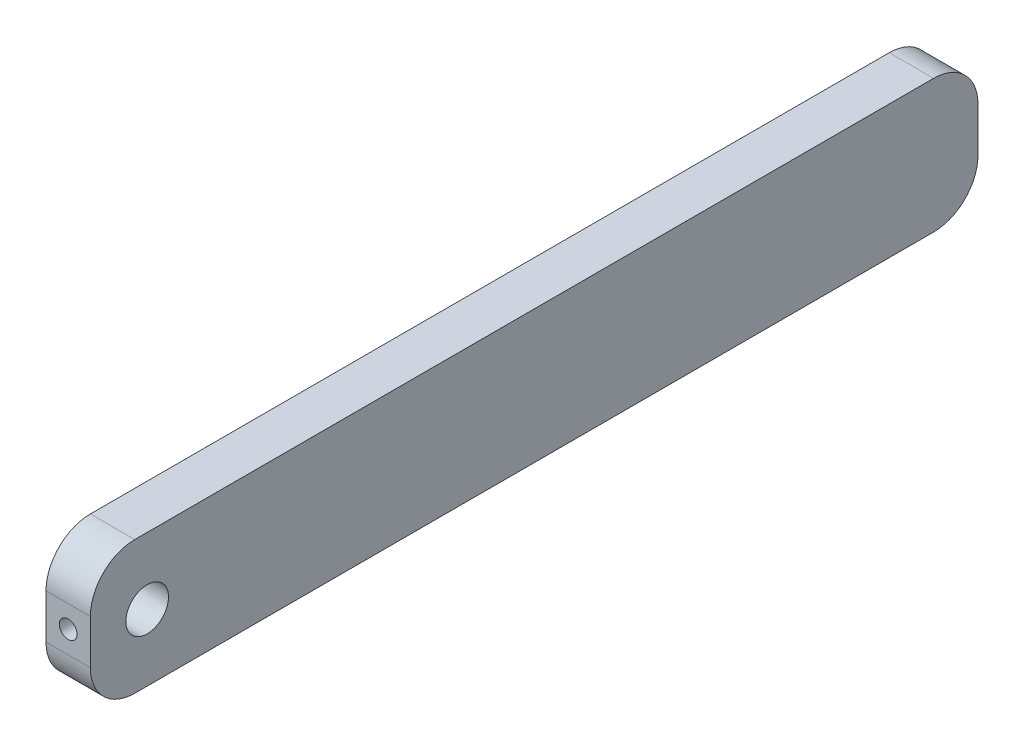
ISO-10303-21;
HEADER;
FILE_DESCRIPTION(('STEP AP214'),'2;1');
FILE_NAME('part.step','',(''),(''),'','','');
FILE_SCHEMA(('AUTOMOTIVE_DESIGN { 1 0 10303 214 1 1 1 1 }'));
ENDSEC;
DATA;
#1=APPLICATION_CONTEXT('core data for automotive mechanical design processes');
#2=APPLICATION_PROTOCOL_DEFINITION('international standard','automotive_design',2000,#1);
#3=PRODUCT_CONTEXT('',#1,'mechanical');
#4=PRODUCT('Part','Part','',(#3));
#5=PRODUCT_RELATED_PRODUCT_CATEGORY('part','',(#4));
#6=PRODUCT_DEFINITION_FORMATION('','',#4);
#7=PRODUCT_DEFINITION_CONTEXT('part definition',#1,'design');
#8=PRODUCT_DEFINITION('design','',#6,#7);
#9=PRODUCT_DEFINITION_SHAPE('','',#8);
#10=(LENGTH_UNIT() NAMED_UNIT(*) SI_UNIT(.MILLI.,.METRE.));
#11=(NAMED_UNIT(*) PLANE_ANGLE_UNIT() SI_UNIT($,.RADIAN.));
#12=(NAMED_UNIT(*) SI_UNIT($,.STERADIAN.) SOLID_ANGLE_UNIT());
#13=UNCERTAINTY_MEASURE_WITH_UNIT(LENGTH_MEASURE(1.E-05),#10,'distance_accuracy_value','');
#14=(GEOMETRIC_REPRESENTATION_CONTEXT(3) GLOBAL_UNCERTAINTY_ASSIGNED_CONTEXT((#13)) GLOBAL_UNIT_ASSIGNED_CONTEXT((#10,
#11,#12)) REPRESENTATION_CONTEXT('',''));
#15=CARTESIAN_POINT('',(0.,0.,0.));
#16=DIRECTION('',(0.,0.,1.));
#17=DIRECTION('',(1.,0.,0.));
#18=AXIS2_PLACEMENT_3D('',#15,#16,#17);
#19=CARTESIAN_POINT('',(5.,0.,0.));
#20=DIRECTION('',(0.,0.,-1.));
#21=DIRECTION('',(-1.,0.,0.));
#22=AXIS2_PLACEMENT_3D('',#19,#20,#21);
#23=PLANE('',#22);
#24=CARTESIAN_POINT('',(2.5,7.5,0.));
#25=DIRECTION('',(0.,0.,1.));
#26=DIRECTION('',(1.,0.,0.));
#27=AXIS2_PLACEMENT_3D('',#24,#25,#26);
#28=CIRCLE('',#27,1.);
#29=CARTESIAN_POINT('',(3.5,7.5,0.));
#30=VERTEX_POINT('',#29);
#31=EDGE_CURVE('E186',#30,#30,#28,.T.);
#32=ORIENTED_EDGE('',*,*,#31,.F.);
#33=EDGE_LOOP('',(#32));
#34=FACE_BOUND('',#33,.T.);
#35=DIRECTION('',(0.,-1.,0.));
#36=VECTOR('',#35,1.);
#37=CARTESIAN_POINT('',(0.,0.,0.));
#38=LINE('',#37,#36);
#39=CARTESIAN_POINT('',(0.,10.,0.));
#40=VERTEX_POINT('',#39);
#41=CARTESIAN_POINT('',(0.,5.,0.));
#42=VERTEX_POINT('',#41);
#43=EDGE_CURVE('E139',#40,#42,#38,.T.);
#44=ORIENTED_EDGE('',*,*,#43,.T.);
#45=DIRECTION('',(-1.,0.,0.));
#46=VECTOR('',#45,1.);
#47=CARTESIAN_POINT('',(5.,5.,0.));
#48=LINE('',#47,#46);
#49=CARTESIAN_POINT('',(5.,5.,0.));
#50=VERTEX_POINT('',#49);
#51=EDGE_CURVE('E11',#42,#50,#48,.F.);
#52=ORIENTED_EDGE('',*,*,#51,.T.);
#53=DIRECTION('',(0.,-1.,0.));
#54=VECTOR('',#53,1.);
#55=CARTESIAN_POINT('',(5.,0.,0.));
#56=LINE('',#55,#54);
#57=CARTESIAN_POINT('',(5.,10.,0.));
#58=VERTEX_POINT('',#57);
#59=EDGE_CURVE('E137',#58,#50,#56,.T.);
#60=ORIENTED_EDGE('',*,*,#59,.F.);
#61=DIRECTION('',(-1.,0.,0.));
#62=VECTOR('',#61,1.);
#63=CARTESIAN_POINT('',(5.,10.,0.));
#64=LINE('',#63,#62);
#65=EDGE_CURVE('E51',#58,#40,#64,.T.);
#66=ORIENTED_EDGE('',*,*,#65,.T.);
#67=EDGE_LOOP('',(#44,#52,#60,#66));
#68=FACE_BOUND('',#67,.T.);
#69=ADVANCED_FACE('F37',(#34,#68),#23,.F.);
#70=CARTESIAN_POINT('',(5.,0.,0.));
#71=DIRECTION('',(0.,1.,0.));
#72=DIRECTION('',(0.,0.,1.));
#73=AXIS2_PLACEMENT_3D('',#70,#71,#72);
#74=PLANE('',#73);
#75=DIRECTION('',(0.,0.,-1.));
#76=VECTOR('',#75,1.);
#77=CARTESIAN_POINT('',(0.,0.,0.));
#78=LINE('',#77,#76);
#79=CARTESIAN_POINT('',(0.,0.,-5.));
#80=VERTEX_POINT('',#79);
#81=CARTESIAN_POINT('',(0.,0.,-95.));
#82=VERTEX_POINT('',#81);
#83=EDGE_CURVE('E135',#80,#82,#78,.T.);
#84=ORIENTED_EDGE('',*,*,#83,.T.);
#85=DIRECTION('',(-1.,0.,0.));
#86=VECTOR('',#85,1.);
#87=CARTESIAN_POINT('',(5.,0.,-95.));
#88=LINE('',#87,#86);
#89=CARTESIAN_POINT('',(5.,0.,-95.));
#90=VERTEX_POINT('',#89);
#91=EDGE_CURVE('E114',#82,#90,#88,.F.);
#92=ORIENTED_EDGE('',*,*,#91,.T.);
#93=DIRECTION('',(0.,0.,-1.));
#94=VECTOR('',#93,1.);
#95=CARTESIAN_POINT('',(5.,0.,0.));
#96=LINE('',#95,#94);
#97=CARTESIAN_POINT('',(5.,0.,-5.));
#98=VERTEX_POINT('',#97);
#99=EDGE_CURVE('E180',#98,#90,#96,.T.);
#100=ORIENTED_EDGE('',*,*,#99,.F.);
#101=DIRECTION('',(-1.,0.,0.));
#102=VECTOR('',#101,1.);
#103=CARTESIAN_POINT('',(5.,0.,-5.));
#104=LINE('',#103,#102);
#105=EDGE_CURVE('E119',#98,#80,#104,.T.);
#106=ORIENTED_EDGE('',*,*,#105,.T.);
#107=EDGE_LOOP('',(#84,#92,#100,#106));
#108=FACE_BOUND('',#107,.T.);
#109=ADVANCED_FACE('F204',(#108),#74,.F.);
#110=CARTESIAN_POINT('',(5.,0.,-100.));
#111=DIRECTION('',(0.,0.,1.));
#112=DIRECTION('',(1.,0.,0.));
#113=AXIS2_PLACEMENT_3D('',#110,#111,#112);
#114=PLANE('',#113);
#115=DIRECTION('',(0.,1.,0.));
#116=VECTOR('',#115,1.);
#117=CARTESIAN_POINT('',(5.,0.,-100.));
#118=LINE('',#117,#116);
#119=CARTESIAN_POINT('',(5.,5.,-100.));
#120=VERTEX_POINT('',#119);
#121=CARTESIAN_POINT('',(5.,10.,-100.));
#122=VERTEX_POINT('',#121);
#123=EDGE_CURVE('E128',#120,#122,#118,.T.);
#124=ORIENTED_EDGE('',*,*,#123,.F.);
#125=DIRECTION('',(-1.,0.,0.));
#126=VECTOR('',#125,1.);
#127=CARTESIAN_POINT('',(5.,5.,-100.));
#128=LINE('',#127,#126);
#129=CARTESIAN_POINT('',(0.,5.,-100.));
#130=VERTEX_POINT('',#129);
#131=EDGE_CURVE('E113',#120,#130,#128,.T.);
#132=ORIENTED_EDGE('',*,*,#131,.T.);
#133=DIRECTION('',(0.,1.,0.));
#134=VECTOR('',#133,1.);
#135=CARTESIAN_POINT('',(0.,0.,-100.));
#136=LINE('',#135,#134);
#137=CARTESIAN_POINT('',(0.,10.,-100.));
#138=VERTEX_POINT('',#137);
#139=EDGE_CURVE('E126',#130,#138,#136,.T.);
#140=ORIENTED_EDGE('',*,*,#139,.T.);
#141=DIRECTION('',(-1.,0.,0.));
#142=VECTOR('',#141,1.);
#143=CARTESIAN_POINT('',(5.,10.,-100.));
#144=LINE('',#143,#142);
#145=EDGE_CURVE('E130',#138,#122,#144,.F.);
#146=ORIENTED_EDGE('',*,*,#145,.T.);
#147=EDGE_LOOP('',(#124,#132,#140,#146));
#148=FACE_BOUND('',#147,.T.);
#149=ADVANCED_FACE('F125',(#148),#114,.F.);
#150=CARTESIAN_POINT('',(5.,15.,0.));
#151=DIRECTION('',(0.,-1.,0.));
#152=DIRECTION('',(0.,0.,-1.));
#153=AXIS2_PLACEMENT_3D('',#150,#151,#152);
#154=PLANE('',#153);
#155=DIRECTION('',(0.,0.,1.));
#156=VECTOR('',#155,1.);
#157=CARTESIAN_POINT('',(5.,15.,0.));
#158=LINE('',#157,#156);
#159=CARTESIAN_POINT('',(5.,15.,-95.));
#160=VERTEX_POINT('',#159);
#161=CARTESIAN_POINT('',(5.,15.,-5.));
#162=VERTEX_POINT('',#161);
#163=EDGE_CURVE('E143',#160,#162,#158,.T.);
#164=ORIENTED_EDGE('',*,*,#163,.F.);
#165=DIRECTION('',(-1.,0.,0.));
#166=VECTOR('',#165,1.);
#167=CARTESIAN_POINT('',(5.,15.,-95.));
#168=LINE('',#167,#166);
#169=CARTESIAN_POINT('',(0.,15.,-95.));
#170=VERTEX_POINT('',#169);
#171=EDGE_CURVE('E160',#160,#170,#168,.T.);
#172=ORIENTED_EDGE('',*,*,#171,.T.);
#173=DIRECTION('',(0.,0.,1.));
#174=VECTOR('',#173,1.);
#175=CARTESIAN_POINT('',(0.,15.,0.));
#176=LINE('',#175,#174);
#177=CARTESIAN_POINT('',(0.,15.,-5.));
#178=VERTEX_POINT('',#177);
#179=EDGE_CURVE('E134',#170,#178,#176,.T.);
#180=ORIENTED_EDGE('',*,*,#179,.T.);
#181=DIRECTION('',(-1.,0.,0.));
#182=VECTOR('',#181,1.);
#183=CARTESIAN_POINT('',(5.,15.,-5.));
#184=LINE('',#183,#182);
#185=EDGE_CURVE('E58',#178,#162,#184,.F.);
#186=ORIENTED_EDGE('',*,*,#185,.T.);
#187=EDGE_LOOP('',(#164,#172,#180,#186));
#188=FACE_BOUND('',#187,.T.);
#189=ADVANCED_FACE('F228',(#188),#154,.F.);
#190=CARTESIAN_POINT('',(5.,0.,0.));
#191=DIRECTION('',(-1.,0.,0.));
#192=DIRECTION('',(0.,0.,1.));
#193=AXIS2_PLACEMENT_3D('',#190,#191,#192);
#194=PLANE('',#193);
#195=CARTESIAN_POINT('',(5.,7.5,-6.4));
#196=DIRECTION('',(1.,0.,0.));
#197=DIRECTION('',(0.,0.,-1.));
#198=AXIS2_PLACEMENT_3D('',#195,#196,#197);
#199=CIRCLE('',#198,2.4);
#200=CARTESIAN_POINT('',(5.,7.5,-8.8));
#201=VERTEX_POINT('',#200);
#202=EDGE_CURVE('E175',#201,#201,#199,.T.);
#203=ORIENTED_EDGE('',*,*,#202,.F.);
#204=EDGE_LOOP('',(#203));
#205=FACE_BOUND('',#204,.T.);
#206=ORIENTED_EDGE('',*,*,#99,.T.);
#207=CARTESIAN_POINT('',(5.,5.,-95.));
#208=DIRECTION('',(-1.,0.,0.));
#209=DIRECTION('',(0.,0.,1.));
#210=AXIS2_PLACEMENT_3D('',#207,#208,#209);
#211=CIRCLE('',#210,5.);
#212=EDGE_CURVE('E157',#90,#120,#211,.F.);
#213=ORIENTED_EDGE('',*,*,#212,.T.);
#214=ORIENTED_EDGE('',*,*,#123,.T.);
#215=CARTESIAN_POINT('',(5.,10.,-95.));
#216=DIRECTION('',(-1.,0.,0.));
#217=DIRECTION('',(0.,0.,1.));
#218=AXIS2_PLACEMENT_3D('',#215,#216,#217);
#219=CIRCLE('',#218,5.);
#220=EDGE_CURVE('E65',#122,#160,#219,.F.);
#221=ORIENTED_EDGE('',*,*,#220,.T.);
#222=ORIENTED_EDGE('',*,*,#163,.T.);
#223=CARTESIAN_POINT('',(5.,10.,-5.));
#224=DIRECTION('',(-1.,0.,0.));
#225=DIRECTION('',(0.,0.,1.));
#226=AXIS2_PLACEMENT_3D('',#223,#224,#225);
#227=CIRCLE('',#226,5.);
#228=EDGE_CURVE('E152',#162,#58,#227,.F.);
#229=ORIENTED_EDGE('',*,*,#228,.T.);
#230=ORIENTED_EDGE('',*,*,#59,.T.);
#231=CARTESIAN_POINT('',(5.,5.,-5.));
#232=DIRECTION('',(-1.,0.,0.));
#233=DIRECTION('',(0.,0.,1.));
#234=AXIS2_PLACEMENT_3D('',#231,#232,#233);
#235=CIRCLE('',#234,5.);
#236=EDGE_CURVE('E154',#50,#98,#235,.F.);
#237=ORIENTED_EDGE('',*,*,#236,.T.);
#238=EDGE_LOOP('',(#206,#213,#214,#221,#222,#229,#230,#237));
#239=FACE_BOUND('',#238,.T.);
#240=ADVANCED_FACE('F226',(#205,#239),#194,.F.);
#241=CARTESIAN_POINT('',(0.,0.,0.));
#242=DIRECTION('',(-1.,0.,0.));
#243=DIRECTION('',(0.,0.,1.));
#244=AXIS2_PLACEMENT_3D('',#241,#242,#243);
#245=PLANE('',#244);
#246=CARTESIAN_POINT('',(0.,7.5,-6.4));
#247=DIRECTION('',(1.,0.,0.));
#248=DIRECTION('',(0.,0.,-1.));
#249=AXIS2_PLACEMENT_3D('',#246,#247,#248);
#250=CIRCLE('',#249,2.4);
#251=CARTESIAN_POINT('',(0.,7.5,-8.8));
#252=VERTEX_POINT('',#251);
#253=EDGE_CURVE('E173',#252,#252,#250,.T.);
#254=ORIENTED_EDGE('',*,*,#253,.T.);
#255=EDGE_LOOP('',(#254));
#256=FACE_BOUND('',#255,.T.);
#257=ORIENTED_EDGE('',*,*,#139,.F.);
#258=CARTESIAN_POINT('',(0.,5.,-95.));
#259=DIRECTION('',(-1.,0.,0.));
#260=DIRECTION('',(0.,0.,1.));
#261=AXIS2_PLACEMENT_3D('',#258,#259,#260);
#262=CIRCLE('',#261,5.);
#263=EDGE_CURVE('E109',#130,#82,#262,.T.);
#264=ORIENTED_EDGE('',*,*,#263,.T.);
#265=ORIENTED_EDGE('',*,*,#83,.F.);
#266=CARTESIAN_POINT('',(0.,5.,-5.));
#267=DIRECTION('',(-1.,0.,0.));
#268=DIRECTION('',(0.,0.,1.));
#269=AXIS2_PLACEMENT_3D('',#266,#267,#268);
#270=CIRCLE('',#269,5.);
#271=EDGE_CURVE('E146',#80,#42,#270,.T.);
#272=ORIENTED_EDGE('',*,*,#271,.T.);
#273=ORIENTED_EDGE('',*,*,#43,.F.);
#274=CARTESIAN_POINT('',(0.,10.,-5.));
#275=DIRECTION('',(-1.,0.,0.));
#276=DIRECTION('',(0.,0.,1.));
#277=AXIS2_PLACEMENT_3D('',#274,#275,#276);
#278=CIRCLE('',#277,5.);
#279=EDGE_CURVE('E129',#40,#178,#278,.T.);
#280=ORIENTED_EDGE('',*,*,#279,.T.);
#281=ORIENTED_EDGE('',*,*,#179,.F.);
#282=CARTESIAN_POINT('',(0.,10.,-95.));
#283=DIRECTION('',(-1.,0.,0.));
#284=DIRECTION('',(0.,0.,1.));
#285=AXIS2_PLACEMENT_3D('',#282,#283,#284);
#286=CIRCLE('',#285,5.);
#287=EDGE_CURVE('E120',#170,#138,#286,.T.);
#288=ORIENTED_EDGE('',*,*,#287,.T.);
#289=EDGE_LOOP('',(#257,#264,#265,#272,#273,#280,#281,#288));
#290=FACE_BOUND('',#289,.T.);
#291=ADVANCED_FACE('F132',(#256,#290),#245,.T.);
#292=CARTESIAN_POINT('',(0.,7.5,-6.4));
#293=DIRECTION('',(1.,0.,0.));
#294=DIRECTION('',(0.,0.,-1.));
#295=AXIS2_PLACEMENT_3D('',#292,#293,#294);
#296=CYLINDRICAL_SURFACE('',#295,2.4);
#297=CARTESIAN_POINT('',(3.5,7.5,-4.));
#298=CARTESIAN_POINT('',(3.49999423592696,7.55356644210901,-4.00000433306182));
#299=CARTESIAN_POINT('',(3.49567043317749,7.60721711765107,-4.00181413620232));
#300=CARTESIAN_POINT('',(3.47852874806386,7.71299789692508,-4.00887877136359));
#301=CARTESIAN_POINT('',(3.4656887004286,7.76512366113885,-4.01414259279178));
#302=CARTESIAN_POINT('',(3.43207112657553,7.86615098692247,-4.02754968769499));
#303=CARTESIAN_POINT('',(3.41132048842548,7.91506281954101,-4.03568320019997));
#304=CARTESIAN_POINT('',(3.36258174141395,8.00866380534384,-4.05403770823469));
#305=CARTESIAN_POINT('',(3.33459582482331,8.05335423201275,-4.06425807125721));
#306=CARTESIAN_POINT('',(3.2706968139273,8.13955872284761,-4.08633737318505));
#307=CARTESIAN_POINT('',(3.2344789529682,8.18083301401422,-4.09824997339126));
#308=CARTESIAN_POINT('',(3.15578853217395,8.25692785687301,-4.12213828745189));
#309=CARTESIAN_POINT('',(3.1133127000844,8.29174501052247,-4.13411403114553));
#310=CARTESIAN_POINT('',(3.02077857794808,8.35562990157653,-4.15743182549604));
#311=CARTESIAN_POINT('',(2.97045004125876,8.3843304652314,-4.16871370501293));
#312=CARTESIAN_POINT('',(2.86514139366326,8.43275152471093,-4.18851542114396));
#313=CARTESIAN_POINT('',(2.81016369641244,8.45247664669033,-4.19703667999342));
#314=CARTESIAN_POINT('',(2.69987704658566,8.48139678649727,-4.20977155689837));
#315=CARTESIAN_POINT('',(2.64471161328628,8.49105326302085,-4.21417289878571));
#316=CARTESIAN_POINT('',(2.53338136585074,8.50100167974237,-4.21870939024397));
#317=CARTESIAN_POINT('',(2.47721711997941,8.50129878443518,-4.21884689259793));
#318=CARTESIAN_POINT('',(2.37007995165205,8.49286760290939,-4.21499904351318));
#319=CARTESIAN_POINT('',(2.31903912274843,8.48482944889841,-4.21132893821102));
#320=CARTESIAN_POINT('',(2.21911032719969,8.46111352812621,-4.20081213780963));
#321=CARTESIAN_POINT('',(2.17022277480658,8.44543429829742,-4.19396483437149));
#322=CARTESIAN_POINT('',(2.07475383760685,8.40657566982057,-4.17771052181795));
#323=CARTESIAN_POINT('',(2.0282436632693,8.38324377231389,-4.16825214440691));
#324=CARTESIAN_POINT('',(1.93961781289588,8.3298499406445,-4.14785335087132));
#325=CARTESIAN_POINT('',(1.89750387950919,8.29978535241564,-4.13691235096177));
#326=CARTESIAN_POINT('',(1.81512003301373,8.23079677243507,-4.11365618497617));
#327=CARTESIAN_POINT('',(1.77530674609165,8.19133878656602,-4.10130302876422));
#328=CARTESIAN_POINT('',(1.70270919763265,8.10618367284121,-4.07739461509977));
#329=CARTESIAN_POINT('',(1.66992658264626,8.06048508755877,-4.06583954498392));
#330=CARTESIAN_POINT('',(1.61165134110699,7.9627583589547,-4.04449373154822));
#331=CARTESIAN_POINT('',(1.58634444387945,7.91060846595814,-4.03474986765333));
#332=CARTESIAN_POINT('',(1.54502308831739,7.80228192202147,-4.01848414868158));
#333=CARTESIAN_POINT('',(1.52900349444495,7.74610751583603,-4.0119605132336));
#334=CARTESIAN_POINT('',(1.50766720629869,7.63514249067698,-4.00320287050892));
#335=CARTESIAN_POINT('',(1.501737714045,7.58048902822291,-4.000723671623));
#336=CARTESIAN_POINT('',(1.49892302110872,7.47091627560313,-3.99955159705004));
#337=CARTESIAN_POINT('',(1.5020352237984,7.41599706627789,-4.00085763430449));
#338=CARTESIAN_POINT('',(1.51677686784485,7.31032140612685,-4.00695025874448));
#339=CARTESIAN_POINT('',(1.52797596327776,7.25949362668849,-4.01156090172809));
#340=CARTESIAN_POINT('',(1.55797455563263,7.16049380082313,-4.02361114582069));
#341=CARTESIAN_POINT('',(1.57677501276024,7.11232209078531,-4.03105110432237));
#342=CARTESIAN_POINT('',(1.62205678056969,7.01831280010469,-4.04833383483868));
#343=CARTESIAN_POINT('',(1.64875854651683,6.97259421051574,-4.05824406824575));
#344=CARTESIAN_POINT('',(1.70884270223335,6.88612302701486,-4.07940956336728));
#345=CARTESIAN_POINT('',(1.74222788122342,6.84537251791845,-4.09066538585014));
#346=CARTESIAN_POINT('',(1.81752258661792,6.76693325578059,-4.1143032968365));
#347=CARTESIAN_POINT('',(1.85987080238901,6.72967144161613,-4.12670838727177));
#348=CARTESIAN_POINT('',(1.95041702074831,6.66266412311559,-4.15052530585596));
#349=CARTESIAN_POINT('',(1.99861634813739,6.63292032571506,-4.1619369080525));
#350=CARTESIAN_POINT('',(2.10049134024206,6.58147231833041,-4.1825489100481));
#351=CARTESIAN_POINT('',(2.15423522841186,6.55988865410137,-4.19171549955911));
#352=CARTESIAN_POINT('',(2.26509647504808,6.52626068838742,-4.20633315472835));
#353=CARTESIAN_POINT('',(2.32221100998668,6.5142085210905,-4.21178728355399));
#354=CARTESIAN_POINT('',(2.43345495935937,6.50076735720879,-4.21789468370189));
#355=CARTESIAN_POINT('',(2.48747572983409,6.49862895669497,-4.2188851922627));
#356=CARTESIAN_POINT('',(2.59507428891288,6.5030753958087,-4.21684917591181));
#357=CARTESIAN_POINT('',(2.64865214425095,6.50965889628223,-4.21382326767755));
#358=CARTESIAN_POINT('',(2.75127419797511,6.53073276175607,-4.20440358958186));
#359=CARTESIAN_POINT('',(2.80041333877071,6.54484077142827,-4.19817316122816));
#360=CARTESIAN_POINT('',(2.89563841708578,6.58018937438292,-4.18317455040649));
#361=CARTESIAN_POINT('',(2.94172349231903,6.60143197186198,-4.17440565494646));
#362=CARTESIAN_POINT('',(3.0325567167593,6.65191771251608,-4.1546643635199));
#363=CARTESIAN_POINT('',(3.07705786413463,6.68156511271613,-4.14359117829057));
#364=CARTESIAN_POINT('',(3.16068811148854,6.74745274189569,-4.12077048756929));
#365=CARTESIAN_POINT('',(3.19981534048046,6.7836952568755,-4.109022749233));
#366=CARTESIAN_POINT('',(3.27451894534779,6.86487836337694,-4.08514885719915));
#367=CARTESIAN_POINT('',(3.30962914627252,6.91026020804078,-4.07305745990567));
#368=CARTESIAN_POINT('',(3.3717595628349,7.00671993659744,-4.05071885102384));
#369=CARTESIAN_POINT('',(3.39877609191164,7.0578004016434,-4.04047248066608));
#370=CARTESIAN_POINT('',(3.44336787635191,7.16341435462564,-4.02312653310032));
#371=CARTESIAN_POINT('',(3.46109181329384,7.21787680721549,-4.01597773934429));
#372=CARTESIAN_POINT('',(3.48696506326227,7.32927166252275,-4.00543192185101));
#373=CARTESIAN_POINT('',(3.49514435402391,7.38619574641523,-4.00202315350427));
#374=CARTESIAN_POINT('',(3.49946652886916,7.46221113446465,-4.00022169944853));
#375=CARTESIAN_POINT('',(3.50000203371938,7.48110032425947,-3.99999847117972));
#376=CARTESIAN_POINT('',(3.5,7.5,-4.));
#377=B_SPLINE_CURVE_WITH_KNOTS('',3,(#297,#298,#299,#300,#301,#302,#303,#304,#305,#306,#307,
#308,#309,#310,#311,#312,#313,#314,#315,#316,#317,#318,#319,#320,#321,#322,#323,#324,#325,#326,
#327,#328,#329,#330,#331,#332,#333,#334,#335,#336,#337,#338,#339,#340,#341,#342,#343,#344,#345,
#346,#347,#348,#349,#350,#351,#352,#353,#354,#355,#356,#357,#358,#359,#360,#361,#362,#363,#364,
#365,#366,#367,#368,#369,#370,#371,#372,#373,#374,#375,#376),.UNSPECIFIED.,.T.,.F.,(4,2,2,2,2,2,
2,2,2,2,2,2,2,2,2,2,2,2,2,2,2,2,2,2,2,2,2,2,2,2,2,2,2,2,2,2,2,2,2,4),(0.,0.16064553510715,
0.321710832502957,0.482233481525039,0.642707549482379,0.810543490310456,0.978467505051725,
1.154653796313,1.33074917384471,1.49836218510046,1.66588270599237,1.82056125762045,
1.9752694378177,2.13326970446972,2.29133236573765,2.46275312902317,2.63421399451671,
2.80963244048651,2.98495379374638,3.14918754714601,3.31337413994538,3.46941271788577,
3.62547101281428,3.78637708217729,3.94735044375597,4.11982790423436,4.29234448992273,
4.46731830687619,4.64214757659665,4.80351902047715,4.96486569038029,5.1187011997181,
5.2725799596049,5.43571114717953,5.59889898740756,5.77397228003912,5.94912519542866,
6.12138284655509,6.29309800375457,6.34977805199279),.UNSPECIFIED.);
#378=CARTESIAN_POINT('',(3.5,7.5,-4.));
#379=VERTEX_POINT('',#378);
#380=EDGE_CURVE('E41',#379,#379,#377,.T.);
#381=ORIENTED_EDGE('',*,*,#380,.T.);
#382=EDGE_LOOP('',(#381));
#383=FACE_BOUND('',#382,.T.);
#384=ORIENTED_EDGE('',*,*,#253,.F.);
#385=EDGE_LOOP('',(#384));
#386=FACE_BOUND('',#385,.T.);
#387=ORIENTED_EDGE('',*,*,#202,.T.);
#388=EDGE_LOOP('',(#387));
#389=FACE_BOUND('',#388,.T.);
#390=ADVANCED_FACE('F193',(#383,#386,#389),#296,.F.);
#391=CARTESIAN_POINT('',(5.,5.,-95.));
#392=DIRECTION('',(-1.,0.,0.));
#393=DIRECTION('',(0.,0.,1.));
#394=AXIS2_PLACEMENT_3D('',#391,#392,#393);
#395=CYLINDRICAL_SURFACE('',#394,5.);
#396=ORIENTED_EDGE('',*,*,#212,.F.);
#397=ORIENTED_EDGE('',*,*,#91,.F.);
#398=ORIENTED_EDGE('',*,*,#263,.F.);
#399=ORIENTED_EDGE('',*,*,#131,.F.);
#400=EDGE_LOOP('',(#396,#397,#398,#399));
#401=FACE_BOUND('',#400,.T.);
#402=ADVANCED_FACE('F112',(#401),#395,.T.);
#403=CARTESIAN_POINT('',(5.,10.,-95.));
#404=DIRECTION('',(-1.,0.,0.));
#405=DIRECTION('',(0.,0.,1.));
#406=AXIS2_PLACEMENT_3D('',#403,#404,#405);
#407=CYLINDRICAL_SURFACE('',#406,5.);
#408=ORIENTED_EDGE('',*,*,#220,.F.);
#409=ORIENTED_EDGE('',*,*,#145,.F.);
#410=ORIENTED_EDGE('',*,*,#287,.F.);
#411=ORIENTED_EDGE('',*,*,#171,.F.);
#412=EDGE_LOOP('',(#408,#409,#410,#411));
#413=FACE_BOUND('',#412,.T.);
#414=ADVANCED_FACE('F216',(#413),#407,.T.);
#415=CARTESIAN_POINT('',(5.,5.,-5.));
#416=DIRECTION('',(-1.,0.,0.));
#417=DIRECTION('',(0.,0.,1.));
#418=AXIS2_PLACEMENT_3D('',#415,#416,#417);
#419=CYLINDRICAL_SURFACE('',#418,5.);
#420=ORIENTED_EDGE('',*,*,#236,.F.);
#421=ORIENTED_EDGE('',*,*,#51,.F.);
#422=ORIENTED_EDGE('',*,*,#271,.F.);
#423=ORIENTED_EDGE('',*,*,#105,.F.);
#424=EDGE_LOOP('',(#420,#421,#422,#423));
#425=FACE_BOUND('',#424,.T.);
#426=ADVANCED_FACE('F201',(#425),#419,.T.);
#427=CARTESIAN_POINT('',(5.,10.,-5.));
#428=DIRECTION('',(-1.,0.,0.));
#429=DIRECTION('',(0.,0.,1.));
#430=AXIS2_PLACEMENT_3D('',#427,#428,#429);
#431=CYLINDRICAL_SURFACE('',#430,5.);
#432=ORIENTED_EDGE('',*,*,#228,.F.);
#433=ORIENTED_EDGE('',*,*,#185,.F.);
#434=ORIENTED_EDGE('',*,*,#279,.F.);
#435=ORIENTED_EDGE('',*,*,#65,.F.);
#436=EDGE_LOOP('',(#432,#433,#434,#435));
#437=FACE_BOUND('',#436,.T.);
#438=ADVANCED_FACE('F39',(#437),#431,.T.);
#439=CARTESIAN_POINT('',(2.5,7.5,-7.));
#440=DIRECTION('',(0.,0.,1.));
#441=DIRECTION('',(1.,0.,0.));
#442=AXIS2_PLACEMENT_3D('',#439,#440,#441);
#443=CYLINDRICAL_SURFACE('',#442,1.);
#444=ORIENTED_EDGE('',*,*,#31,.T.);
#445=EDGE_LOOP('',(#444));
#446=FACE_BOUND('',#445,.T.);
#447=ORIENTED_EDGE('',*,*,#380,.F.);
#448=EDGE_LOOP('',(#447));
#449=FACE_BOUND('',#448,.T.);
#450=ADVANCED_FACE('F196',(#446,#449),#443,.F.);
#451=CLOSED_SHELL('',(#69,#109,#149,#189,#240,#291,#390,#402,#414,#426,#438,#450));
#452=MANIFOLD_SOLID_BREP('B2',#451);
#453=ADVANCED_BREP_SHAPE_REPRESENTATION('',(#18,#452),#14);
#454=SHAPE_DEFINITION_REPRESENTATION(#9,#453);
ENDSEC;
END-ISO-10303-21;
